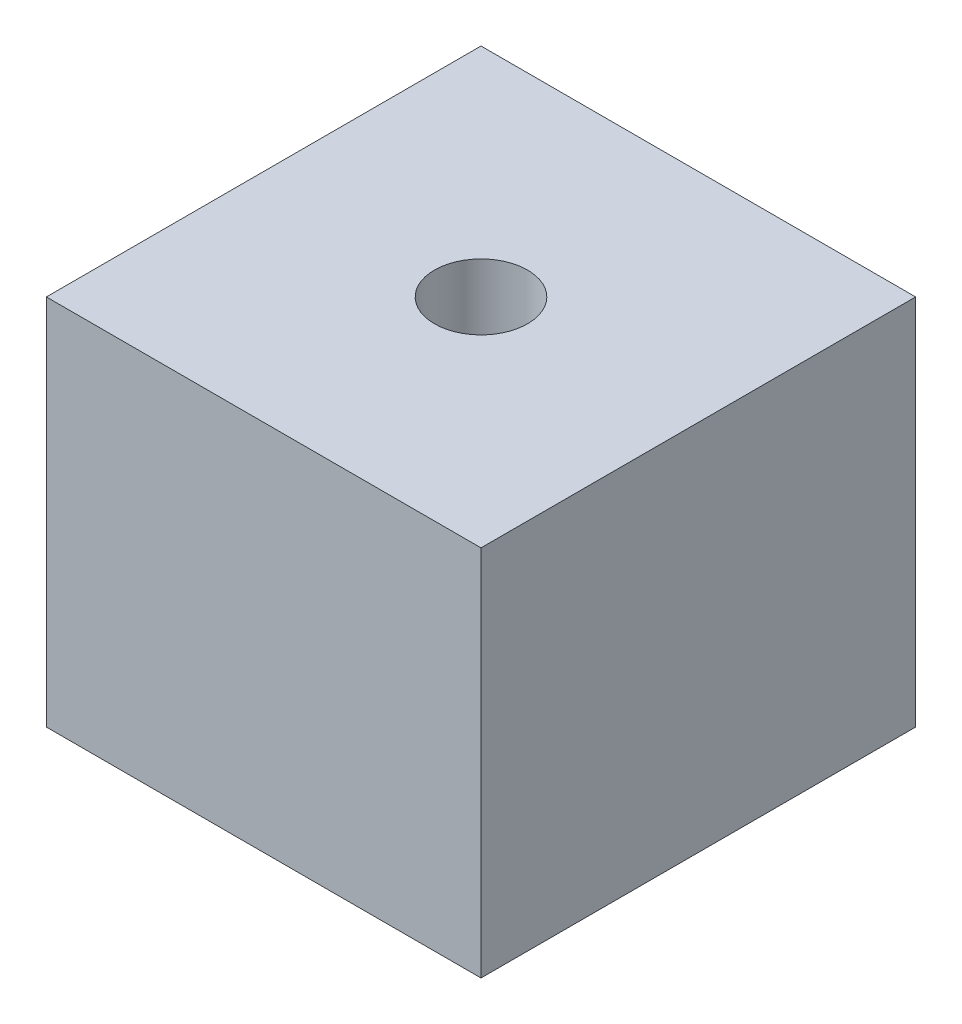
ISO-10303-21;
HEADER;
FILE_DESCRIPTION(('STEP AP214'),'2;1');
FILE_NAME('part.step','',(''),(''),'','','');
FILE_SCHEMA(('AUTOMOTIVE_DESIGN { 1 0 10303 214 1 1 1 1 }'));
ENDSEC;
DATA;
#1=APPLICATION_CONTEXT('core data for automotive mechanical design processes');
#2=APPLICATION_PROTOCOL_DEFINITION('international standard','automotive_design',2000,#1);
#3=PRODUCT_CONTEXT('',#1,'mechanical');
#4=PRODUCT('Part','Part','',(#3));
#5=PRODUCT_RELATED_PRODUCT_CATEGORY('part','',(#4));
#6=PRODUCT_DEFINITION_FORMATION('','',#4);
#7=PRODUCT_DEFINITION_CONTEXT('part definition',#1,'design');
#8=PRODUCT_DEFINITION('design','',#6,#7);
#9=PRODUCT_DEFINITION_SHAPE('','',#8);
#10=(LENGTH_UNIT() NAMED_UNIT(*) SI_UNIT(.MILLI.,.METRE.));
#11=(NAMED_UNIT(*) PLANE_ANGLE_UNIT() SI_UNIT($,.RADIAN.));
#12=(NAMED_UNIT(*) SI_UNIT($,.STERADIAN.) SOLID_ANGLE_UNIT());
#13=UNCERTAINTY_MEASURE_WITH_UNIT(LENGTH_MEASURE(1.E-05),#10,'distance_accuracy_value','');
#14=(GEOMETRIC_REPRESENTATION_CONTEXT(3) GLOBAL_UNCERTAINTY_ASSIGNED_CONTEXT((#13)) GLOBAL_UNIT_ASSIGNED_CONTEXT((#10,
#11,#12)) REPRESENTATION_CONTEXT('',''));
#15=CARTESIAN_POINT('',(0.,0.,0.));
#16=DIRECTION('',(0.,0.,1.));
#17=DIRECTION('',(1.,0.,0.));
#18=AXIS2_PLACEMENT_3D('',#15,#16,#17);
#19=CARTESIAN_POINT('',(0.,76.2,0.));
#20=DIRECTION('',(1.,0.,0.));
#21=DIRECTION('',(0.,0.,-1.));
#22=AXIS2_PLACEMENT_3D('',#19,#20,#21);
#23=PLANE('',#22);
#24=DIRECTION('',(0.,0.,1.));
#25=VECTOR('',#24,1.);
#26=CARTESIAN_POINT('',(0.,0.,0.));
#27=LINE('',#26,#25);
#28=CARTESIAN_POINT('',(0.,0.,0.));
#29=VERTEX_POINT('',#28);
#30=CARTESIAN_POINT('',(0.,0.,88.9));
#31=VERTEX_POINT('',#30);
#32=EDGE_CURVE('E100',#29,#31,#27,.T.);
#33=ORIENTED_EDGE('',*,*,#32,.T.);
#34=DIRECTION('',(0.,-1.,0.));
#35=VECTOR('',#34,1.);
#36=CARTESIAN_POINT('',(0.,76.2,88.9));
#37=LINE('',#36,#35);
#38=CARTESIAN_POINT('',(0.,76.2,88.9));
#39=VERTEX_POINT('',#38);
#40=EDGE_CURVE('E11',#39,#31,#37,.T.);
#41=ORIENTED_EDGE('',*,*,#40,.F.);
#42=DIRECTION('',(0.,0.,1.));
#43=VECTOR('',#42,1.);
#44=CARTESIAN_POINT('',(0.,76.2,0.));
#45=LINE('',#44,#43);
#46=CARTESIAN_POINT('',(0.,76.2,0.));
#47=VERTEX_POINT('',#46);
#48=EDGE_CURVE('E86',#47,#39,#45,.T.);
#49=ORIENTED_EDGE('',*,*,#48,.F.);
#50=DIRECTION('',(0.,-1.,0.));
#51=VECTOR('',#50,1.);
#52=CARTESIAN_POINT('',(0.,76.2,0.));
#53=LINE('',#52,#51);
#54=EDGE_CURVE('E53',#47,#29,#53,.T.);
#55=ORIENTED_EDGE('',*,*,#54,.T.);
#56=EDGE_LOOP('',(#33,#41,#49,#55));
#57=FACE_BOUND('',#56,.T.);
#58=ADVANCED_FACE('F37',(#57),#23,.F.);
#59=CARTESIAN_POINT('',(0.,76.2,88.9));
#60=DIRECTION('',(0.,0.,-1.));
#61=DIRECTION('',(-1.,0.,0.));
#62=AXIS2_PLACEMENT_3D('',#59,#60,#61);
#63=PLANE('',#62);
#64=DIRECTION('',(1.,0.,0.));
#65=VECTOR('',#64,1.);
#66=CARTESIAN_POINT('',(0.,0.,88.9));
#67=LINE('',#66,#65);
#68=CARTESIAN_POINT('',(88.9,0.,88.9));
#69=VERTEX_POINT('',#68);
#70=EDGE_CURVE('E91',#31,#69,#67,.T.);
#71=ORIENTED_EDGE('',*,*,#70,.T.);
#72=DIRECTION('',(0.,-1.,0.));
#73=VECTOR('',#72,1.);
#74=CARTESIAN_POINT('',(88.9,76.2,88.9));
#75=LINE('',#74,#73);
#76=CARTESIAN_POINT('',(88.9,76.2,88.9));
#77=VERTEX_POINT('',#76);
#78=EDGE_CURVE('E45',#77,#69,#75,.T.);
#79=ORIENTED_EDGE('',*,*,#78,.F.);
#80=DIRECTION('',(1.,0.,0.));
#81=VECTOR('',#80,1.);
#82=CARTESIAN_POINT('',(0.,76.2,88.9));
#83=LINE('',#82,#81);
#84=EDGE_CURVE('E78',#39,#77,#83,.T.);
#85=ORIENTED_EDGE('',*,*,#84,.F.);
#86=ORIENTED_EDGE('',*,*,#40,.T.);
#87=EDGE_LOOP('',(#71,#79,#85,#86));
#88=FACE_BOUND('',#87,.T.);
#89=ADVANCED_FACE('F90',(#88),#63,.F.);
#90=CARTESIAN_POINT('',(88.9,76.2,0.));
#91=DIRECTION('',(1.,0.,0.));
#92=DIRECTION('',(0.,0.,-1.));
#93=AXIS2_PLACEMENT_3D('',#90,#91,#92);
#94=PLANE('',#93);
#95=DIRECTION('',(0.,0.,1.));
#96=VECTOR('',#95,1.);
#97=CARTESIAN_POINT('',(88.9,0.,0.));
#98=LINE('',#97,#96);
#99=CARTESIAN_POINT('',(88.9,0.,0.));
#100=VERTEX_POINT('',#99);
#101=EDGE_CURVE('E104',#100,#69,#98,.T.);
#102=ORIENTED_EDGE('',*,*,#101,.F.);
#103=DIRECTION('',(0.,-1.,0.));
#104=VECTOR('',#103,1.);
#105=CARTESIAN_POINT('',(88.9,76.2,0.));
#106=LINE('',#105,#104);
#107=CARTESIAN_POINT('',(88.9,76.2,0.));
#108=VERTEX_POINT('',#107);
#109=EDGE_CURVE('E67',#108,#100,#106,.T.);
#110=ORIENTED_EDGE('',*,*,#109,.F.);
#111=DIRECTION('',(0.,0.,1.));
#112=VECTOR('',#111,1.);
#113=CARTESIAN_POINT('',(88.9,76.2,0.));
#114=LINE('',#113,#112);
#115=EDGE_CURVE('E85',#108,#77,#114,.T.);
#116=ORIENTED_EDGE('',*,*,#115,.T.);
#117=ORIENTED_EDGE('',*,*,#78,.T.);
#118=EDGE_LOOP('',(#102,#110,#116,#117));
#119=FACE_BOUND('',#118,.T.);
#120=ADVANCED_FACE('F94',(#119),#94,.T.);
#121=CARTESIAN_POINT('',(0.,76.2,0.));
#122=DIRECTION('',(0.,0.,-1.));
#123=DIRECTION('',(-1.,0.,0.));
#124=AXIS2_PLACEMENT_3D('',#121,#122,#123);
#125=PLANE('',#124);
#126=DIRECTION('',(1.,0.,0.));
#127=VECTOR('',#126,1.);
#128=CARTESIAN_POINT('',(0.,0.,0.));
#129=LINE('',#128,#127);
#130=EDGE_CURVE('E106',#29,#100,#129,.T.);
#131=ORIENTED_EDGE('',*,*,#130,.F.);
#132=ORIENTED_EDGE('',*,*,#54,.F.);
#133=DIRECTION('',(1.,0.,0.));
#134=VECTOR('',#133,1.);
#135=CARTESIAN_POINT('',(0.,76.2,0.));
#136=LINE('',#135,#134);
#137=EDGE_CURVE('E95',#47,#108,#136,.T.);
#138=ORIENTED_EDGE('',*,*,#137,.T.);
#139=ORIENTED_EDGE('',*,*,#109,.T.);
#140=EDGE_LOOP('',(#131,#132,#138,#139));
#141=FACE_BOUND('',#140,.T.);
#142=ADVANCED_FACE('F128',(#141),#125,.T.);
#143=CARTESIAN_POINT('',(0.,76.2,0.));
#144=DIRECTION('',(0.,1.,0.));
#145=DIRECTION('',(0.,0.,1.));
#146=AXIS2_PLACEMENT_3D('',#143,#144,#145);
#147=PLANE('',#146);
#148=CARTESIAN_POINT('',(44.45,76.2,44.45));
#149=DIRECTION('',(0.,1.,0.));
#150=DIRECTION('',(0.,0.,1.));
#151=AXIS2_PLACEMENT_3D('',#148,#149,#150);
#152=CIRCLE('',#151,9.525);
#153=CARTESIAN_POINT('',(44.45,76.2,53.975));
#154=VERTEX_POINT('',#153);
#155=EDGE_CURVE('E112',#154,#154,#152,.T.);
#156=ORIENTED_EDGE('',*,*,#155,.F.);
#157=EDGE_LOOP('',(#156));
#158=FACE_BOUND('',#157,.T.);
#159=ORIENTED_EDGE('',*,*,#48,.T.);
#160=ORIENTED_EDGE('',*,*,#84,.T.);
#161=ORIENTED_EDGE('',*,*,#115,.F.);
#162=ORIENTED_EDGE('',*,*,#137,.F.);
#163=EDGE_LOOP('',(#159,#160,#161,#162));
#164=FACE_BOUND('',#163,.T.);
#165=ADVANCED_FACE('F82',(#158,#164),#147,.T.);
#166=CARTESIAN_POINT('',(0.,0.,0.));
#167=DIRECTION('',(0.,1.,0.));
#168=DIRECTION('',(0.,0.,1.));
#169=AXIS2_PLACEMENT_3D('',#166,#167,#168);
#170=PLANE('',#169);
#171=ORIENTED_EDGE('',*,*,#32,.F.);
#172=ORIENTED_EDGE('',*,*,#130,.T.);
#173=ORIENTED_EDGE('',*,*,#101,.T.);
#174=ORIENTED_EDGE('',*,*,#70,.F.);
#175=EDGE_LOOP('',(#171,#172,#173,#174));
#176=FACE_BOUND('',#175,.T.);
#177=ADVANCED_FACE('F123',(#176),#170,.F.);
#178=CARTESIAN_POINT('',(44.45,38.1,44.45));
#179=DIRECTION('',(0.,1.,0.));
#180=DIRECTION('',(0.,0.,1.));
#181=AXIS2_PLACEMENT_3D('',#178,#179,#180);
#182=CYLINDRICAL_SURFACE('',#181,9.525);
#183=CARTESIAN_POINT('',(44.45,38.1,44.45));
#184=DIRECTION('',(0.,1.,0.));
#185=DIRECTION('',(0.,0.,1.));
#186=AXIS2_PLACEMENT_3D('',#183,#184,#185);
#187=CIRCLE('',#186,9.525);
#188=CARTESIAN_POINT('',(44.45,38.1,53.975));
#189=VERTEX_POINT('',#188);
#190=EDGE_CURVE('E102',#189,#189,#187,.T.);
#191=CARTESIAN_POINT('',(44.45,38.1,53.975));
#192=CARTESIAN_POINT('',(44.45,38.496875,53.975));
#193=CARTESIAN_POINT('',(44.45,38.89375,53.975));
#194=CARTESIAN_POINT('',(44.45,39.6875,53.975));
#195=CARTESIAN_POINT('',(44.45,40.084375,53.975));
#196=CARTESIAN_POINT('',(44.45,40.878125,53.975));
#197=CARTESIAN_POINT('',(44.45,41.275,53.975));
#198=CARTESIAN_POINT('',(44.45,42.06875,53.975));
#199=CARTESIAN_POINT('',(44.45,42.465625,53.975));
#200=CARTESIAN_POINT('',(44.45,43.259375,53.975));
#201=CARTESIAN_POINT('',(44.45,43.65625,53.975));
#202=CARTESIAN_POINT('',(44.45,44.45,53.975));
#203=CARTESIAN_POINT('',(44.45,44.846875,53.975));
#204=CARTESIAN_POINT('',(44.45,45.640625,53.975));
#205=CARTESIAN_POINT('',(44.45,46.0375,53.975));
#206=CARTESIAN_POINT('',(44.45,46.83125,53.975));
#207=CARTESIAN_POINT('',(44.45,47.228125,53.975));
#208=CARTESIAN_POINT('',(44.45,48.021875,53.975));
#209=CARTESIAN_POINT('',(44.45,48.41875,53.975));
#210=CARTESIAN_POINT('',(44.45,49.2125,53.975));
#211=CARTESIAN_POINT('',(44.45,49.609375,53.975));
#212=CARTESIAN_POINT('',(44.45,50.403125,53.975));
#213=CARTESIAN_POINT('',(44.45,50.8,53.975));
#214=CARTESIAN_POINT('',(44.45,51.59375,53.975));
#215=CARTESIAN_POINT('',(44.45,51.990625,53.975));
#216=CARTESIAN_POINT('',(44.45,52.784375,53.975));
#217=CARTESIAN_POINT('',(44.45,53.18125,53.975));
#218=CARTESIAN_POINT('',(44.45,53.975,53.975));
#219=CARTESIAN_POINT('',(44.45,54.371875,53.975));
#220=CARTESIAN_POINT('',(44.45,55.165625,53.975));
#221=CARTESIAN_POINT('',(44.45,55.5625,53.975));
#222=CARTESIAN_POINT('',(44.45,56.35625,53.975));
#223=CARTESIAN_POINT('',(44.45,56.753125,53.975));
#224=CARTESIAN_POINT('',(44.45,57.546875,53.975));
#225=CARTESIAN_POINT('',(44.45,57.94375,53.975));
#226=CARTESIAN_POINT('',(44.45,58.7375,53.975));
#227=CARTESIAN_POINT('',(44.45,59.134375,53.975));
#228=CARTESIAN_POINT('',(44.45,59.928125,53.975));
#229=CARTESIAN_POINT('',(44.45,60.325,53.975));
#230=CARTESIAN_POINT('',(44.45,61.11875,53.975));
#231=CARTESIAN_POINT('',(44.45,61.515625,53.975));
#232=CARTESIAN_POINT('',(44.45,62.309375,53.975));
#233=CARTESIAN_POINT('',(44.45,62.70625,53.975));
#234=CARTESIAN_POINT('',(44.45,63.5,53.975));
#235=CARTESIAN_POINT('',(44.45,63.896875,53.975));
#236=CARTESIAN_POINT('',(44.45,64.690625,53.975));
#237=CARTESIAN_POINT('',(44.45,65.0875,53.975));
#238=CARTESIAN_POINT('',(44.45,65.88125,53.975));
#239=CARTESIAN_POINT('',(44.45,66.278125,53.975));
#240=CARTESIAN_POINT('',(44.45,67.071875,53.975));
#241=CARTESIAN_POINT('',(44.45,67.46875,53.975));
#242=CARTESIAN_POINT('',(44.45,68.2625,53.975));
#243=CARTESIAN_POINT('',(44.45,68.659375,53.975));
#244=CARTESIAN_POINT('',(44.45,69.453125,53.975));
#245=CARTESIAN_POINT('',(44.45,69.85,53.975));
#246=CARTESIAN_POINT('',(44.45,70.64375,53.975));
#247=CARTESIAN_POINT('',(44.45,71.040625,53.975));
#248=CARTESIAN_POINT('',(44.45,71.834375,53.975));
#249=CARTESIAN_POINT('',(44.45,72.23125,53.975));
#250=CARTESIAN_POINT('',(44.45,73.025,53.975));
#251=CARTESIAN_POINT('',(44.45,73.421875,53.975));
#252=CARTESIAN_POINT('',(44.45,74.215625,53.975));
#253=CARTESIAN_POINT('',(44.45,74.6125,53.975));
#254=CARTESIAN_POINT('',(44.45,75.40625,53.975));
#255=CARTESIAN_POINT('',(44.45,75.803125,53.975));
#256=CARTESIAN_POINT('',(44.45,76.2,53.975));
#257=B_SPLINE_CURVE_WITH_KNOTS('',3,(#191,#192,#193,#194,#195,#196,#197,#198,#199,#200,#201,
#202,#203,#204,#205,#206,#207,#208,#209,#210,#211,#212,#213,#214,#215,#216,#217,#218,#219,#220,
#221,#222,#223,#224,#225,#226,#227,#228,#229,#230,#231,#232,#233,#234,#235,#236,#237,#238,#239,
#240,#241,#242,#243,#244,#245,#246,#247,#248,#249,#250,#251,#252,#253,#254,#255,#256),
.UNSPECIFIED.,.F.,.F.,(4,2,2,2,2,2,2,2,2,2,2,2,2,2,2,2,2,2,2,2,2,2,2,2,2,2,2,2,2,2,2,2,4),(0.,
1.19062499999999,2.38124999999999,3.571875,4.7625,5.953125,7.14375,8.334375,9.525,10.715625,
11.90625,13.096875,14.2875,15.478125,16.66875,17.859375,19.05,20.240625,21.43125,22.621875,
23.8125,25.003125,26.19375,27.384375,28.575,29.765625,30.95625,32.146875,33.3375,34.528125,
35.71875,36.909375,38.1),.UNSPECIFIED.);
#258=EDGE_CURVE('BSEAM120',#189,#154,#257,.T.);
#259=ORIENTED_EDGE('',*,*,#190,.F.);
#260=ORIENTED_EDGE('',*,*,#155,.T.);
#261=ORIENTED_EDGE('',*,*,#258,.T.);
#262=ORIENTED_EDGE('',*,*,#258,.F.);
#263=EDGE_LOOP('',(#259,#261,#260,#262));
#264=FACE_BOUND('',#263,.T.);
#265=ADVANCED_FACE('F120',(#264),#182,.F.);
#266=CARTESIAN_POINT('',(44.45,38.1,44.45));
#267=DIRECTION('',(0.,1.,0.));
#268=DIRECTION('',(0.,0.,1.));
#269=AXIS2_PLACEMENT_3D('',#266,#267,#268);
#270=PLANE('',#269);
#271=ORIENTED_EDGE('',*,*,#190,.T.);
#272=EDGE_LOOP('',(#271));
#273=FACE_BOUND('',#272,.T.);
#274=ADVANCED_FACE('F118',(#273),#270,.T.);
#275=CLOSED_SHELL('',(#58,#89,#120,#142,#165,#177,#265,#274));
#276=MANIFOLD_SOLID_BREP('B2',#275);
#277=ADVANCED_BREP_SHAPE_REPRESENTATION('',(#18,#276),#14);
#278=SHAPE_DEFINITION_REPRESENTATION(#9,#277);
ENDSEC;
END-ISO-10303-21;
